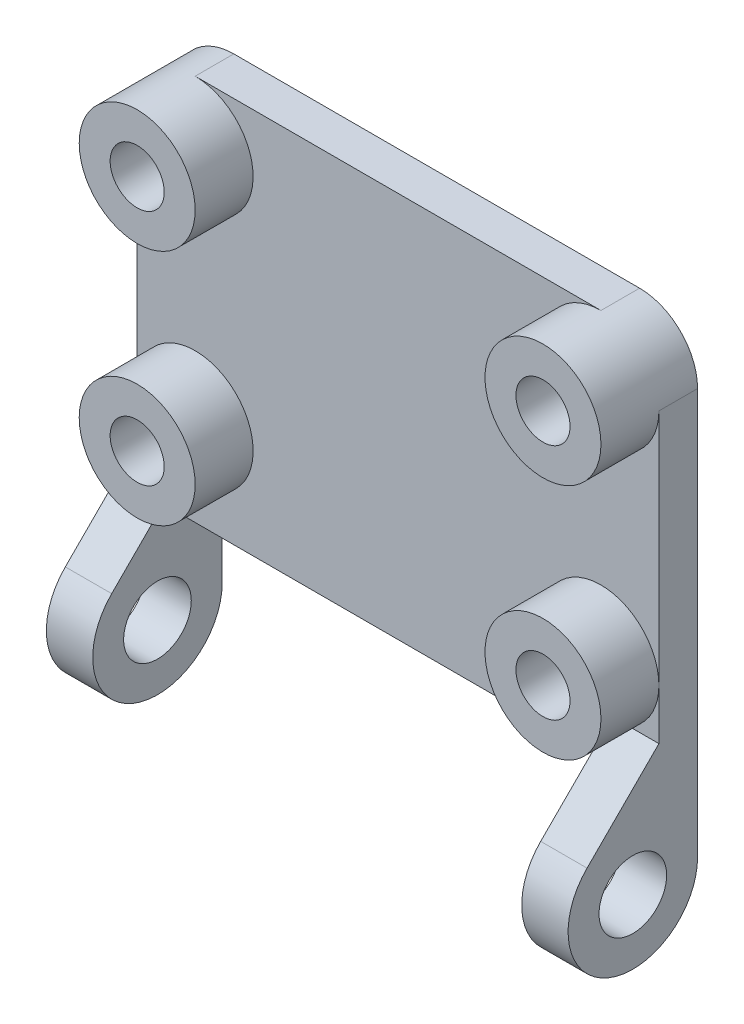
ISO-10303-21;
HEADER;
FILE_DESCRIPTION(('STEP AP214'),'2;1');
FILE_NAME('part.step','',(''),(''),'','','');
FILE_SCHEMA(('AUTOMOTIVE_DESIGN { 1 0 10303 214 1 1 1 1 }'));
ENDSEC;
DATA;
#1=APPLICATION_CONTEXT('core data for automotive mechanical design processes');
#2=APPLICATION_PROTOCOL_DEFINITION('international standard','automotive_design',2000,#1);
#3=PRODUCT_CONTEXT('',#1,'mechanical');
#4=PRODUCT('Part','Part','',(#3));
#5=PRODUCT_RELATED_PRODUCT_CATEGORY('part','',(#4));
#6=PRODUCT_DEFINITION_FORMATION('','',#4);
#7=PRODUCT_DEFINITION_CONTEXT('part definition',#1,'design');
#8=PRODUCT_DEFINITION('design','',#6,#7);
#9=PRODUCT_DEFINITION_SHAPE('','',#8);
#10=(LENGTH_UNIT() NAMED_UNIT(*) SI_UNIT(.MILLI.,.METRE.));
#11=(NAMED_UNIT(*) PLANE_ANGLE_UNIT() SI_UNIT($,.RADIAN.));
#12=(NAMED_UNIT(*) SI_UNIT($,.STERADIAN.) SOLID_ANGLE_UNIT());
#13=UNCERTAINTY_MEASURE_WITH_UNIT(LENGTH_MEASURE(1.E-05),#10,'distance_accuracy_value','');
#14=(GEOMETRIC_REPRESENTATION_CONTEXT(3) GLOBAL_UNCERTAINTY_ASSIGNED_CONTEXT((#13)) GLOBAL_UNIT_ASSIGNED_CONTEXT((#10,
#11,#12)) REPRESENTATION_CONTEXT('',''));
#15=CARTESIAN_POINT('',(0.,0.,0.));
#16=DIRECTION('',(0.,0.,1.));
#17=DIRECTION('',(1.,0.,0.));
#18=AXIS2_PLACEMENT_3D('',#15,#16,#17);
#19=CARTESIAN_POINT('',(0.,0.,2.));
#20=DIRECTION('',(0.,0.,-1.));
#21=DIRECTION('',(-1.,0.,0.));
#22=AXIS2_PLACEMENT_3D('',#19,#20,#21);
#23=PLANE('',#22);
#24=CARTESIAN_POINT('',(10.5,7.,2.));
#25=DIRECTION('',(0.,0.,1.));
#26=DIRECTION('',(1.,0.,0.));
#27=AXIS2_PLACEMENT_3D('',#24,#25,#26);
#28=CIRCLE('',#27,3.);
#29=CARTESIAN_POINT('',(10.5,10.,2.));
#30=VERTEX_POINT('',#29);
#31=CARTESIAN_POINT('',(13.5,7.,2.));
#32=VERTEX_POINT('',#31);
#33=EDGE_CURVE('E148',#30,#32,#28,.T.);
#34=ORIENTED_EDGE('',*,*,#33,.F.);
#35=DIRECTION('',(-1.,0.,0.));
#36=VECTOR('',#35,1.);
#37=CARTESIAN_POINT('',(-13.5,10.,2.));
#38=LINE('',#37,#36);
#39=CARTESIAN_POINT('',(-10.5,10.,2.));
#40=VERTEX_POINT('',#39);
#41=EDGE_CURVE('E157',#30,#40,#38,.T.);
#42=ORIENTED_EDGE('',*,*,#41,.T.);
#43=CARTESIAN_POINT('',(-10.5,7.,2.));
#44=DIRECTION('',(0.,0.,1.));
#45=DIRECTION('',(1.,0.,0.));
#46=AXIS2_PLACEMENT_3D('',#43,#44,#45);
#47=CIRCLE('',#46,3.);
#48=CARTESIAN_POINT('',(-13.5,7.,2.));
#49=VERTEX_POINT('',#48);
#50=EDGE_CURVE('E201',#49,#40,#47,.T.);
#51=ORIENTED_EDGE('',*,*,#50,.F.);
#52=DIRECTION('',(0.,-1.,0.));
#53=VECTOR('',#52,1.);
#54=CARTESIAN_POINT('',(-13.5,-10.,2.));
#55=LINE('',#54,#53);
#56=CARTESIAN_POINT('',(-13.5,-5.3,2.));
#57=VERTEX_POINT('',#56);
#58=EDGE_CURVE('E285',#49,#57,#55,.T.);
#59=ORIENTED_EDGE('',*,*,#58,.T.);
#60=CARTESIAN_POINT('',(-10.5,-5.3,2.));
#61=DIRECTION('',(0.,0.,1.));
#62=DIRECTION('',(1.,0.,0.));
#63=AXIS2_PLACEMENT_3D('',#60,#61,#62);
#64=CIRCLE('',#63,3.);
#65=CARTESIAN_POINT('',(-11.1,-8.23938769133981,2.));
#66=VERTEX_POINT('',#65);
#67=EDGE_CURVE('E188',#66,#57,#64,.T.);
#68=ORIENTED_EDGE('',*,*,#67,.F.);
#69=DIRECTION('',(0.,1.,0.));
#70=VECTOR('',#69,1.);
#71=CARTESIAN_POINT('',(-11.1,-7.91238456605009,2.));
#72=LINE('',#71,#70);
#73=CARTESIAN_POINT('',(-11.1,-10.,2.));
#74=VERTEX_POINT('',#73);
#75=EDGE_CURVE('E224',#74,#66,#72,.T.);
#76=ORIENTED_EDGE('',*,*,#75,.F.);
#77=DIRECTION('',(1.,0.,0.));
#78=VECTOR('',#77,1.);
#79=CARTESIAN_POINT('',(-13.5,-10.,2.));
#80=LINE('',#79,#78);
#81=CARTESIAN_POINT('',(11.1,-10.,2.));
#82=VERTEX_POINT('',#81);
#83=EDGE_CURVE('E288',#74,#82,#80,.T.);
#84=ORIENTED_EDGE('',*,*,#83,.T.);
#85=DIRECTION('',(0.,1.,0.));
#86=VECTOR('',#85,1.);
#87=CARTESIAN_POINT('',(11.1,-7.91238456605009,2.));
#88=LINE('',#87,#86);
#89=CARTESIAN_POINT('',(11.1,-8.23938769133981,2.));
#90=VERTEX_POINT('',#89);
#91=EDGE_CURVE('E249',#82,#90,#88,.T.);
#92=ORIENTED_EDGE('',*,*,#91,.T.);
#93=CARTESIAN_POINT('',(10.5,-5.3,2.));
#94=DIRECTION('',(0.,0.,1.));
#95=DIRECTION('',(1.,0.,0.));
#96=AXIS2_PLACEMENT_3D('',#93,#94,#95);
#97=CIRCLE('',#96,3.);
#98=CARTESIAN_POINT('',(13.5,-5.3,2.));
#99=VERTEX_POINT('',#98);
#100=EDGE_CURVE('E48',#99,#90,#97,.T.);
#101=ORIENTED_EDGE('',*,*,#100,.F.);
#102=DIRECTION('',(0.,1.,0.));
#103=VECTOR('',#102,1.);
#104=CARTESIAN_POINT('',(13.5,-10.,2.));
#105=LINE('',#104,#103);
#106=EDGE_CURVE('E165',#99,#32,#105,.T.);
#107=ORIENTED_EDGE('',*,*,#106,.T.);
#108=EDGE_LOOP('',(#34,#42,#51,#59,#68,#76,#84,#92,#101,#107));
#109=FACE_BOUND('',#108,.T.);
#110=ADVANCED_FACE('F33',(#109),#23,.F.);
#111=CARTESIAN_POINT('',(11.9749396187856,-7.91238456605009,2.));
#112=VERTEX_POINT('',#111);
#113=EDGE_CURVE('E56',#112,#99,#97,.T.);
#114=ORIENTED_EDGE('',*,*,#113,.F.);
#115=DIRECTION('',(1.,0.,0.));
#116=VECTOR('',#115,1.);
#117=CARTESIAN_POINT('',(11.1,-7.91238456605009,2.));
#118=LINE('',#117,#116);
#119=CARTESIAN_POINT('',(13.5,-7.91238456605009,2.));
#120=VERTEX_POINT('',#119);
#121=EDGE_CURVE('E260',#112,#120,#118,.T.);
#122=ORIENTED_EDGE('',*,*,#121,.T.);
#123=EDGE_CURVE('E163',#120,#99,#105,.T.);
#124=ORIENTED_EDGE('',*,*,#123,.T.);
#125=EDGE_LOOP('',(#114,#122,#124));
#126=FACE_BOUND('',#125,.T.);
#127=ADVANCED_FACE('F386',(#126),#23,.F.);
#128=CARTESIAN_POINT('',(11.1,-14.,3.35));
#129=DIRECTION('',(1.,0.,0.));
#130=DIRECTION('',(0.,0.,-1.));
#131=AXIS2_PLACEMENT_3D('',#128,#129,#130);
#132=PLANE('',#131);
#133=CARTESIAN_POINT('',(11.1,-14.,3.35));
#134=DIRECTION('',(1.,0.,0.));
#135=DIRECTION('',(0.,0.,-1.));
#136=AXIS2_PLACEMENT_3D('',#133,#134,#135);
#137=CIRCLE('',#136,1.75);
#138=CARTESIAN_POINT('',(11.1,-14.,1.6));
#139=VERTEX_POINT('',#138);
#140=EDGE_CURVE('E240',#139,#139,#137,.T.);
#141=ORIENTED_EDGE('',*,*,#140,.T.);
#142=EDGE_LOOP('',(#141));
#143=FACE_BOUND('',#142,.T.);
#144=DIRECTION('',(0.,0.,-1.));
#145=VECTOR('',#144,1.);
#146=CARTESIAN_POINT('',(11.1,-8.23938769133981,5.));
#147=LINE('',#146,#145);
#148=CARTESIAN_POINT('',(11.1,-8.23938769133981,2.32700312528972));
#149=VERTEX_POINT('',#148);
#150=EDGE_CURVE('E11',#90,#149,#147,.F.);
#151=ORIENTED_EDGE('',*,*,#150,.F.);
#152=ORIENTED_EDGE('',*,*,#91,.F.);
#153=DIRECTION('',(0.,0.,1.));
#154=VECTOR('',#153,1.);
#155=CARTESIAN_POINT('',(11.1,-10.,0.));
#156=LINE('',#155,#154);
#157=CARTESIAN_POINT('',(11.1,-10.,0.));
#158=VERTEX_POINT('',#157);
#159=EDGE_CURVE('E246',#158,#82,#156,.T.);
#160=ORIENTED_EDGE('',*,*,#159,.F.);
#161=DIRECTION('',(0.,1.,0.));
#162=VECTOR('',#161,1.);
#163=CARTESIAN_POINT('',(11.1,-10.,0.));
#164=LINE('',#163,#162);
#165=CARTESIAN_POINT('',(11.1,-14.,0.));
#166=VERTEX_POINT('',#165);
#167=EDGE_CURVE('E257',#166,#158,#164,.T.);
#168=ORIENTED_EDGE('',*,*,#167,.F.);
#169=CARTESIAN_POINT('',(11.1,-14.,3.35));
#170=DIRECTION('',(1.,0.,0.));
#171=DIRECTION('',(0.,0.,-1.));
#172=AXIS2_PLACEMENT_3D('',#169,#170,#171);
#173=CIRCLE('',#172,3.35);
#174=CARTESIAN_POINT('',(11.1,-11.6311922830251,5.71880771697495));
#175=VERTEX_POINT('',#174);
#176=EDGE_CURVE('E254',#175,#166,#173,.T.);
#177=ORIENTED_EDGE('',*,*,#176,.F.);
#178=DIRECTION('',(0.,-0.707106781186552,0.707106781186543));
#179=VECTOR('',#178,1.);
#180=CARTESIAN_POINT('',(11.1,-11.6311922830251,5.71880771697495));
#181=LINE('',#180,#179);
#182=EDGE_CURVE('E252',#149,#175,#181,.T.);
#183=ORIENTED_EDGE('',*,*,#182,.F.);
#184=EDGE_LOOP('',(#151,#152,#160,#168,#177,#183));
#185=FACE_BOUND('',#184,.T.);
#186=ADVANCED_FACE('F344',(#143,#185),#132,.F.);
#187=CARTESIAN_POINT('',(-11.9749396187856,-7.91238456605009,2.));
#188=VERTEX_POINT('',#187);
#189=EDGE_CURVE('E193',#57,#188,#64,.T.);
#190=ORIENTED_EDGE('',*,*,#189,.F.);
#191=CARTESIAN_POINT('',(-13.5,-7.91238456605009,2.));
#192=VERTEX_POINT('',#191);
#193=EDGE_CURVE('E162',#57,#192,#55,.T.);
#194=ORIENTED_EDGE('',*,*,#193,.T.);
#195=DIRECTION('',(-1.,0.,0.));
#196=VECTOR('',#195,1.);
#197=CARTESIAN_POINT('',(-11.1,-7.91238456605009,2.));
#198=LINE('',#197,#196);
#199=EDGE_CURVE('E231',#188,#192,#198,.T.);
#200=ORIENTED_EDGE('',*,*,#199,.F.);
#201=EDGE_LOOP('',(#190,#194,#200));
#202=FACE_BOUND('',#201,.T.);
#203=ADVANCED_FACE('F316',(#202),#23,.F.);
#204=CARTESIAN_POINT('',(-11.1,-14.,3.35));
#205=DIRECTION('',(-1.,0.,0.));
#206=DIRECTION('',(0.,0.,-1.));
#207=AXIS2_PLACEMENT_3D('',#204,#205,#206);
#208=PLANE('',#207);
#209=CARTESIAN_POINT('',(-11.1,-14.,3.35));
#210=DIRECTION('',(1.,0.,0.));
#211=DIRECTION('',(0.,0.,-1.));
#212=AXIS2_PLACEMENT_3D('',#209,#210,#211);
#213=CIRCLE('',#212,1.75);
#214=CARTESIAN_POINT('',(-11.1,-14.,1.6));
#215=VERTEX_POINT('',#214);
#216=EDGE_CURVE('E207',#215,#215,#213,.T.);
#217=ORIENTED_EDGE('',*,*,#216,.F.);
#218=EDGE_LOOP('',(#217));
#219=FACE_BOUND('',#218,.T.);
#220=DIRECTION('',(0.,0.,-1.));
#221=VECTOR('',#220,1.);
#222=CARTESIAN_POINT('',(-11.1,-8.23938769133981,5.));
#223=LINE('',#222,#221);
#224=CARTESIAN_POINT('',(-11.1,-8.23938769133981,2.32700312528972));
#225=VERTEX_POINT('',#224);
#226=EDGE_CURVE('E192',#225,#66,#223,.T.);
#227=ORIENTED_EDGE('',*,*,#226,.F.);
#228=DIRECTION('',(0.,-0.707106781186552,0.707106781186543));
#229=VECTOR('',#228,1.);
#230=CARTESIAN_POINT('',(-11.1,-11.6311922830251,5.71880771697495));
#231=LINE('',#230,#229);
#232=CARTESIAN_POINT('',(-11.1,-11.6311922830251,5.71880771697495));
#233=VERTEX_POINT('',#232);
#234=EDGE_CURVE('E222',#225,#233,#231,.T.);
#235=ORIENTED_EDGE('',*,*,#234,.T.);
#236=CARTESIAN_POINT('',(-11.1,-14.,3.35));
#237=DIRECTION('',(1.,0.,0.));
#238=DIRECTION('',(0.,0.,-1.));
#239=AXIS2_PLACEMENT_3D('',#236,#237,#238);
#240=CIRCLE('',#239,3.35);
#241=CARTESIAN_POINT('',(-11.1,-14.,0.));
#242=VERTEX_POINT('',#241);
#243=EDGE_CURVE('E220',#233,#242,#240,.T.);
#244=ORIENTED_EDGE('',*,*,#243,.T.);
#245=DIRECTION('',(0.,1.,0.));
#246=VECTOR('',#245,1.);
#247=CARTESIAN_POINT('',(-11.1,-10.,0.));
#248=LINE('',#247,#246);
#249=CARTESIAN_POINT('',(-11.1,-10.,0.));
#250=VERTEX_POINT('',#249);
#251=EDGE_CURVE('E216',#242,#250,#248,.T.);
#252=ORIENTED_EDGE('',*,*,#251,.T.);
#253=DIRECTION('',(0.,0.,1.));
#254=VECTOR('',#253,1.);
#255=CARTESIAN_POINT('',(-11.1,-10.,0.));
#256=LINE('',#255,#254);
#257=EDGE_CURVE('E213',#250,#74,#256,.T.);
#258=ORIENTED_EDGE('',*,*,#257,.T.);
#259=ORIENTED_EDGE('',*,*,#75,.T.);
#260=EDGE_LOOP('',(#227,#235,#244,#252,#258,#259));
#261=FACE_BOUND('',#260,.T.);
#262=ADVANCED_FACE('F336',(#219,#261),#208,.F.);
#263=CARTESIAN_POINT('',(-13.5,-10.,2.));
#264=DIRECTION('',(0.,1.,0.));
#265=DIRECTION('',(0.,0.,1.));
#266=AXIS2_PLACEMENT_3D('',#263,#264,#265);
#267=PLANE('',#266);
#268=ORIENTED_EDGE('',*,*,#257,.F.);
#269=DIRECTION('',(1.,0.,0.));
#270=VECTOR('',#269,1.);
#271=CARTESIAN_POINT('',(-13.5,-10.,0.));
#272=LINE('',#271,#270);
#273=EDGE_CURVE('E296',#250,#158,#272,.T.);
#274=ORIENTED_EDGE('',*,*,#273,.T.);
#275=ORIENTED_EDGE('',*,*,#159,.T.);
#276=ORIENTED_EDGE('',*,*,#83,.F.);
#277=EDGE_LOOP('',(#268,#274,#275,#276));
#278=FACE_BOUND('',#277,.T.);
#279=ADVANCED_FACE('F340',(#278),#267,.F.);
#280=CARTESIAN_POINT('',(0.,0.,0.));
#281=DIRECTION('',(0.,0.,-1.));
#282=DIRECTION('',(-1.,0.,0.));
#283=AXIS2_PLACEMENT_3D('',#280,#281,#282);
#284=PLANE('',#283);
#285=CARTESIAN_POINT('',(10.5,-5.3,0.));
#286=DIRECTION('',(0.,0.,1.));
#287=DIRECTION('',(1.,0.,0.));
#288=AXIS2_PLACEMENT_3D('',#285,#286,#287);
#289=CIRCLE('',#288,1.4);
#290=CARTESIAN_POINT('',(11.9,-5.3,0.));
#291=VERTEX_POINT('',#290);
#292=EDGE_CURVE('E274',#291,#291,#289,.T.);
#293=ORIENTED_EDGE('',*,*,#292,.T.);
#294=EDGE_LOOP('',(#293));
#295=FACE_BOUND('',#294,.T.);
#296=CARTESIAN_POINT('',(-10.5,7.,0.));
#297=DIRECTION('',(0.,0.,1.));
#298=DIRECTION('',(1.,0.,0.));
#299=AXIS2_PLACEMENT_3D('',#296,#297,#298);
#300=CIRCLE('',#299,1.4);
#301=CARTESIAN_POINT('',(-9.1,7.,0.));
#302=VERTEX_POINT('',#301);
#303=EDGE_CURVE('E280',#302,#302,#300,.T.);
#304=ORIENTED_EDGE('',*,*,#303,.T.);
#305=EDGE_LOOP('',(#304));
#306=FACE_BOUND('',#305,.T.);
#307=DIRECTION('',(-1.,0.,0.));
#308=VECTOR('',#307,1.);
#309=CARTESIAN_POINT('',(-13.5,10.,0.));
#310=LINE('',#309,#308);
#311=CARTESIAN_POINT('',(10.5,10.,0.));
#312=VERTEX_POINT('',#311);
#313=CARTESIAN_POINT('',(-10.5,10.,0.));
#314=VERTEX_POINT('',#313);
#315=EDGE_CURVE('E292',#312,#314,#310,.T.);
#316=ORIENTED_EDGE('',*,*,#315,.F.);
#317=CARTESIAN_POINT('',(10.5,7.,0.));
#318=DIRECTION('',(0.,0.,-1.));
#319=DIRECTION('',(-1.,0.,0.));
#320=AXIS2_PLACEMENT_3D('',#317,#318,#319);
#321=CIRCLE('',#320,3.);
#322=CARTESIAN_POINT('',(13.5,7.,0.));
#323=VERTEX_POINT('',#322);
#324=EDGE_CURVE('E149',#312,#323,#321,.T.);
#325=ORIENTED_EDGE('',*,*,#324,.T.);
#326=DIRECTION('',(0.,1.,0.));
#327=VECTOR('',#326,1.);
#328=CARTESIAN_POINT('',(13.5,-10.,0.));
#329=LINE('',#328,#327);
#330=CARTESIAN_POINT('',(13.5,-14.,0.));
#331=VERTEX_POINT('',#330);
#332=EDGE_CURVE('E283',#331,#323,#329,.T.);
#333=ORIENTED_EDGE('',*,*,#332,.F.);
#334=DIRECTION('',(1.,0.,0.));
#335=VECTOR('',#334,1.);
#336=CARTESIAN_POINT('',(11.1,-14.,0.));
#337=LINE('',#336,#335);
#338=EDGE_CURVE('E265',#166,#331,#337,.T.);
#339=ORIENTED_EDGE('',*,*,#338,.F.);
#340=ORIENTED_EDGE('',*,*,#167,.T.);
#341=ORIENTED_EDGE('',*,*,#273,.F.);
#342=ORIENTED_EDGE('',*,*,#251,.F.);
#343=DIRECTION('',(-1.,0.,0.));
#344=VECTOR('',#343,1.);
#345=CARTESIAN_POINT('',(-11.1,-14.,0.));
#346=LINE('',#345,#344);
#347=CARTESIAN_POINT('',(-13.5,-14.,0.));
#348=VERTEX_POINT('',#347);
#349=EDGE_CURVE('E227',#242,#348,#346,.T.);
#350=ORIENTED_EDGE('',*,*,#349,.T.);
#351=DIRECTION('',(0.,-1.,0.));
#352=VECTOR('',#351,1.);
#353=CARTESIAN_POINT('',(-13.5,-10.,0.));
#354=LINE('',#353,#352);
#355=CARTESIAN_POINT('',(-13.5,7.,0.));
#356=VERTEX_POINT('',#355);
#357=EDGE_CURVE('E294',#356,#348,#354,.T.);
#358=ORIENTED_EDGE('',*,*,#357,.F.);
#359=CARTESIAN_POINT('',(-10.5,7.,0.));
#360=DIRECTION('',(0.,0.,-1.));
#361=DIRECTION('',(-1.,0.,0.));
#362=AXIS2_PLACEMENT_3D('',#359,#360,#361);
#363=CIRCLE('',#362,3.);
#364=EDGE_CURVE('E153',#356,#314,#363,.T.);
#365=ORIENTED_EDGE('',*,*,#364,.T.);
#366=EDGE_LOOP('',(#316,#325,#333,#339,#340,#341,#342,#350,#358,#365));
#367=FACE_BOUND('',#366,.T.);
#368=CARTESIAN_POINT('',(-10.5,-5.3,0.));
#369=DIRECTION('',(0.,0.,1.));
#370=DIRECTION('',(1.,0.,0.));
#371=AXIS2_PLACEMENT_3D('',#368,#369,#370);
#372=CIRCLE('',#371,1.4);
#373=CARTESIAN_POINT('',(-9.1,-5.3,0.));
#374=VERTEX_POINT('',#373);
#375=EDGE_CURVE('E277',#374,#374,#372,.T.);
#376=ORIENTED_EDGE('',*,*,#375,.T.);
#377=EDGE_LOOP('',(#376));
#378=FACE_BOUND('',#377,.T.);
#379=CARTESIAN_POINT('',(10.5,7.,0.));
#380=DIRECTION('',(0.,0.,1.));
#381=DIRECTION('',(1.,0.,0.));
#382=AXIS2_PLACEMENT_3D('',#379,#380,#381);
#383=CIRCLE('',#382,1.4);
#384=CARTESIAN_POINT('',(11.9,7.,0.));
#385=VERTEX_POINT('',#384);
#386=EDGE_CURVE('E268',#385,#385,#383,.T.);
#387=ORIENTED_EDGE('',*,*,#386,.T.);
#388=EDGE_LOOP('',(#387));
#389=FACE_BOUND('',#388,.T.);
#390=ADVANCED_FACE('F327',(#295,#306,#367,#378,#389),#284,.T.);
#391=CARTESIAN_POINT('',(13.5,-10.,2.));
#392=DIRECTION('',(-1.,0.,0.));
#393=DIRECTION('',(0.,0.,1.));
#394=AXIS2_PLACEMENT_3D('',#391,#392,#393);
#395=PLANE('',#394);
#396=ORIENTED_EDGE('',*,*,#123,.F.);
#397=DIRECTION('',(0.,-0.707106781186552,0.707106781186543));
#398=VECTOR('',#397,1.);
#399=CARTESIAN_POINT('',(13.5,-11.6311922830251,5.71880771697495));
#400=LINE('',#399,#398);
#401=CARTESIAN_POINT('',(13.5,-11.6311922830251,5.71880771697495));
#402=VERTEX_POINT('',#401);
#403=EDGE_CURVE('E243',#120,#402,#400,.T.);
#404=ORIENTED_EDGE('',*,*,#403,.T.);
#405=CARTESIAN_POINT('',(13.5,-14.,3.35));
#406=DIRECTION('',(1.,0.,0.));
#407=DIRECTION('',(0.,0.,-1.));
#408=AXIS2_PLACEMENT_3D('',#405,#406,#407);
#409=CIRCLE('',#408,3.35);
#410=EDGE_CURVE('E250',#402,#331,#409,.T.);
#411=ORIENTED_EDGE('',*,*,#410,.T.);
#412=ORIENTED_EDGE('',*,*,#332,.T.);
#413=DIRECTION('',(0.,0.,-1.));
#414=VECTOR('',#413,1.);
#415=CARTESIAN_POINT('',(13.5,7.,2.));
#416=LINE('',#415,#414);
#417=EDGE_CURVE('E301',#323,#32,#416,.F.);
#418=ORIENTED_EDGE('',*,*,#417,.T.);
#419=ORIENTED_EDGE('',*,*,#106,.F.);
#420=EDGE_LOOP('',(#396,#404,#411,#412,#418,#419));
#421=FACE_BOUND('',#420,.T.);
#422=CARTESIAN_POINT('',(13.5,-14.,3.35));
#423=DIRECTION('',(1.,0.,0.));
#424=DIRECTION('',(0.,0.,-1.));
#425=AXIS2_PLACEMENT_3D('',#422,#423,#424);
#426=CIRCLE('',#425,1.75);
#427=CARTESIAN_POINT('',(13.5,-14.,1.6));
#428=VERTEX_POINT('',#427);
#429=EDGE_CURVE('E234',#428,#428,#426,.T.);
#430=ORIENTED_EDGE('',*,*,#429,.F.);
#431=EDGE_LOOP('',(#430));
#432=FACE_BOUND('',#431,.T.);
#433=ADVANCED_FACE('F423',(#421,#432),#395,.F.);
#434=CARTESIAN_POINT('',(-13.5,10.,2.));
#435=DIRECTION('',(0.,-1.,0.));
#436=DIRECTION('',(0.,0.,-1.));
#437=AXIS2_PLACEMENT_3D('',#434,#435,#436);
#438=PLANE('',#437);
#439=ORIENTED_EDGE('',*,*,#41,.F.);
#440=DIRECTION('',(0.,0.,-1.));
#441=VECTOR('',#440,1.);
#442=CARTESIAN_POINT('',(10.5,10.,2.));
#443=LINE('',#442,#441);
#444=EDGE_CURVE('E142',#30,#312,#443,.T.);
#445=ORIENTED_EDGE('',*,*,#444,.T.);
#446=ORIENTED_EDGE('',*,*,#315,.T.);
#447=DIRECTION('',(0.,0.,-1.));
#448=VECTOR('',#447,1.);
#449=CARTESIAN_POINT('',(-10.5,10.,2.));
#450=LINE('',#449,#448);
#451=EDGE_CURVE('E154',#314,#40,#450,.F.);
#452=ORIENTED_EDGE('',*,*,#451,.T.);
#453=EDGE_LOOP('',(#439,#445,#446,#452));
#454=FACE_BOUND('',#453,.T.);
#455=ADVANCED_FACE('F158',(#454),#438,.F.);
#456=CARTESIAN_POINT('',(-13.5,-10.,2.));
#457=DIRECTION('',(1.,0.,0.));
#458=DIRECTION('',(0.,0.,-1.));
#459=AXIS2_PLACEMENT_3D('',#456,#457,#458);
#460=PLANE('',#459);
#461=ORIENTED_EDGE('',*,*,#357,.T.);
#462=CARTESIAN_POINT('',(-13.5,-14.,3.35));
#463=DIRECTION('',(1.,0.,0.));
#464=DIRECTION('',(0.,0.,-1.));
#465=AXIS2_PLACEMENT_3D('',#462,#463,#464);
#466=CIRCLE('',#465,3.35);
#467=CARTESIAN_POINT('',(-13.5,-11.6311922830251,5.71880771697495));
#468=VERTEX_POINT('',#467);
#469=EDGE_CURVE('E210',#468,#348,#466,.T.);
#470=ORIENTED_EDGE('',*,*,#469,.F.);
#471=DIRECTION('',(0.,-0.707106781186552,0.707106781186543));
#472=VECTOR('',#471,1.);
#473=CARTESIAN_POINT('',(-13.5,-11.6311922830251,5.71880771697495));
#474=LINE('',#473,#472);
#475=EDGE_CURVE('E217',#192,#468,#474,.T.);
#476=ORIENTED_EDGE('',*,*,#475,.F.);
#477=ORIENTED_EDGE('',*,*,#193,.F.);
#478=ORIENTED_EDGE('',*,*,#58,.F.);
#479=DIRECTION('',(0.,0.,-1.));
#480=VECTOR('',#479,1.);
#481=CARTESIAN_POINT('',(-13.5,7.,2.));
#482=LINE('',#481,#480);
#483=EDGE_CURVE('E303',#49,#356,#482,.T.);
#484=ORIENTED_EDGE('',*,*,#483,.T.);
#485=EDGE_LOOP('',(#461,#470,#476,#477,#478,#484));
#486=FACE_BOUND('',#485,.T.);
#487=CARTESIAN_POINT('',(-13.5,-14.,3.35));
#488=DIRECTION('',(1.,0.,0.));
#489=DIRECTION('',(0.,0.,-1.));
#490=AXIS2_PLACEMENT_3D('',#487,#488,#489);
#491=CIRCLE('',#490,1.75);
#492=CARTESIAN_POINT('',(-13.5,-14.,1.6));
#493=VERTEX_POINT('',#492);
#494=EDGE_CURVE('E205',#493,#493,#491,.T.);
#495=ORIENTED_EDGE('',*,*,#494,.T.);
#496=EDGE_LOOP('',(#495));
#497=FACE_BOUND('',#496,.T.);
#498=ADVANCED_FACE('F320',(#486,#497),#460,.F.);
#499=CARTESIAN_POINT('',(-10.5,7.,2.));
#500=DIRECTION('',(0.,0.,-1.));
#501=DIRECTION('',(-1.,0.,0.));
#502=AXIS2_PLACEMENT_3D('',#499,#500,#501);
#503=CYLINDRICAL_SURFACE('',#502,1.4);
#504=ORIENTED_EDGE('',*,*,#303,.F.);
#505=EDGE_LOOP('',(#504));
#506=FACE_BOUND('',#505,.T.);
#507=CARTESIAN_POINT('',(-10.5,7.,5.));
#508=DIRECTION('',(0.,0.,1.));
#509=DIRECTION('',(1.,0.,0.));
#510=AXIS2_PLACEMENT_3D('',#507,#508,#509);
#511=CIRCLE('',#510,1.4);
#512=CARTESIAN_POINT('',(-9.1,7.,5.));
#513=VERTEX_POINT('',#512);
#514=EDGE_CURVE('E198',#513,#513,#511,.T.);
#515=ORIENTED_EDGE('',*,*,#514,.T.);
#516=EDGE_LOOP('',(#515));
#517=FACE_BOUND('',#516,.T.);
#518=ADVANCED_FACE('F381',(#506,#517),#503,.F.);
#519=CARTESIAN_POINT('',(-10.5,-5.3,2.));
#520=DIRECTION('',(0.,0.,-1.));
#521=DIRECTION('',(-1.,0.,0.));
#522=AXIS2_PLACEMENT_3D('',#519,#520,#521);
#523=CYLINDRICAL_SURFACE('',#522,1.4);
#524=ORIENTED_EDGE('',*,*,#375,.F.);
#525=EDGE_LOOP('',(#524));
#526=FACE_BOUND('',#525,.T.);
#527=CARTESIAN_POINT('',(-10.5,-5.3,5.));
#528=DIRECTION('',(0.,0.,1.));
#529=DIRECTION('',(1.,0.,0.));
#530=AXIS2_PLACEMENT_3D('',#527,#528,#529);
#531=CIRCLE('',#530,1.4);
#532=CARTESIAN_POINT('',(-9.1,-5.3,5.));
#533=VERTEX_POINT('',#532);
#534=EDGE_CURVE('E185',#533,#533,#531,.T.);
#535=ORIENTED_EDGE('',*,*,#534,.T.);
#536=EDGE_LOOP('',(#535));
#537=FACE_BOUND('',#536,.T.);
#538=ADVANCED_FACE('F372',(#526,#537),#523,.F.);
#539=CARTESIAN_POINT('',(10.5,-5.3,2.));
#540=DIRECTION('',(0.,0.,-1.));
#541=DIRECTION('',(-1.,0.,0.));
#542=AXIS2_PLACEMENT_3D('',#539,#540,#541);
#543=CYLINDRICAL_SURFACE('',#542,1.4);
#544=ORIENTED_EDGE('',*,*,#292,.F.);
#545=EDGE_LOOP('',(#544));
#546=FACE_BOUND('',#545,.T.);
#547=CARTESIAN_POINT('',(10.5,-5.3,5.));
#548=DIRECTION('',(0.,0.,1.));
#549=DIRECTION('',(1.,0.,0.));
#550=AXIS2_PLACEMENT_3D('',#547,#548,#549);
#551=CIRCLE('',#550,1.4);
#552=CARTESIAN_POINT('',(11.9,-5.3,5.));
#553=VERTEX_POINT('',#552);
#554=EDGE_CURVE('E171',#553,#553,#551,.T.);
#555=ORIENTED_EDGE('',*,*,#554,.T.);
#556=EDGE_LOOP('',(#555));
#557=FACE_BOUND('',#556,.T.);
#558=ADVANCED_FACE('F369',(#546,#557),#543,.F.);
#559=CARTESIAN_POINT('',(10.5,7.,2.));
#560=DIRECTION('',(0.,0.,-1.));
#561=DIRECTION('',(-1.,0.,0.));
#562=AXIS2_PLACEMENT_3D('',#559,#560,#561);
#563=CYLINDRICAL_SURFACE('',#562,1.4);
#564=ORIENTED_EDGE('',*,*,#386,.F.);
#565=EDGE_LOOP('',(#564));
#566=FACE_BOUND('',#565,.T.);
#567=CARTESIAN_POINT('',(10.5,7.,5.));
#568=DIRECTION('',(0.,0.,1.));
#569=DIRECTION('',(1.,0.,0.));
#570=AXIS2_PLACEMENT_3D('',#567,#568,#569);
#571=CIRCLE('',#570,1.4);
#572=CARTESIAN_POINT('',(11.9,7.,5.));
#573=VERTEX_POINT('',#572);
#574=EDGE_CURVE('E168',#573,#573,#571,.T.);
#575=ORIENTED_EDGE('',*,*,#574,.T.);
#576=EDGE_LOOP('',(#575));
#577=FACE_BOUND('',#576,.T.);
#578=ADVANCED_FACE('F371',(#566,#577),#563,.F.);
#579=CARTESIAN_POINT('',(10.5,7.,2.));
#580=DIRECTION('',(0.,0.,-1.));
#581=DIRECTION('',(-1.,0.,0.));
#582=AXIS2_PLACEMENT_3D('',#579,#580,#581);
#583=CYLINDRICAL_SURFACE('',#582,3.);
#584=ORIENTED_EDGE('',*,*,#444,.F.);
#585=ORIENTED_EDGE('',*,*,#33,.T.);
#586=ORIENTED_EDGE('',*,*,#417,.F.);
#587=ORIENTED_EDGE('',*,*,#324,.F.);
#588=EDGE_LOOP('',(#584,#585,#586,#587));
#589=FACE_BOUND('',#588,.T.);
#590=CARTESIAN_POINT('',(10.5,7.,5.));
#591=DIRECTION('',(0.,0.,1.));
#592=DIRECTION('',(1.,0.,0.));
#593=AXIS2_PLACEMENT_3D('',#590,#591,#592);
#594=CIRCLE('',#593,3.);
#595=CARTESIAN_POINT('',(13.5,7.,5.));
#596=VERTEX_POINT('',#595);
#597=EDGE_CURVE('E167',#596,#596,#594,.T.);
#598=ORIENTED_EDGE('',*,*,#597,.F.);
#599=EDGE_LOOP('',(#598));
#600=FACE_BOUND('',#599,.T.);
#601=ADVANCED_FACE('F144',(#589,#600),#583,.T.);
#602=CARTESIAN_POINT('',(-10.5,7.,2.));
#603=DIRECTION('',(0.,0.,-1.));
#604=DIRECTION('',(-1.,0.,0.));
#605=AXIS2_PLACEMENT_3D('',#602,#603,#604);
#606=CYLINDRICAL_SURFACE('',#605,3.);
#607=ORIENTED_EDGE('',*,*,#483,.F.);
#608=ORIENTED_EDGE('',*,*,#50,.T.);
#609=ORIENTED_EDGE('',*,*,#451,.F.);
#610=ORIENTED_EDGE('',*,*,#364,.F.);
#611=EDGE_LOOP('',(#607,#608,#609,#610));
#612=FACE_BOUND('',#611,.T.);
#613=CARTESIAN_POINT('',(-10.5,7.,5.));
#614=DIRECTION('',(0.,0.,1.));
#615=DIRECTION('',(1.,0.,0.));
#616=AXIS2_PLACEMENT_3D('',#613,#614,#615);
#617=CIRCLE('',#616,3.);
#618=CARTESIAN_POINT('',(-7.5,7.,5.));
#619=VERTEX_POINT('',#618);
#620=EDGE_CURVE('E202',#619,#619,#617,.T.);
#621=ORIENTED_EDGE('',*,*,#620,.F.);
#622=EDGE_LOOP('',(#621));
#623=FACE_BOUND('',#622,.T.);
#624=ADVANCED_FACE('F35',(#612,#623),#606,.T.);
#625=CARTESIAN_POINT('',(11.1,-14.,3.35));
#626=DIRECTION('',(1.,0.,0.));
#627=DIRECTION('',(0.,0.,-1.));
#628=AXIS2_PLACEMENT_3D('',#625,#626,#627);
#629=CYLINDRICAL_SURFACE('',#628,3.35);
#630=ORIENTED_EDGE('',*,*,#410,.F.);
#631=DIRECTION('',(1.,0.,0.));
#632=VECTOR('',#631,1.);
#633=CARTESIAN_POINT('',(11.1,-11.6311922830251,5.71880771697495));
#634=LINE('',#633,#632);
#635=EDGE_CURVE('E269',#175,#402,#634,.T.);
#636=ORIENTED_EDGE('',*,*,#635,.F.);
#637=ORIENTED_EDGE('',*,*,#176,.T.);
#638=ORIENTED_EDGE('',*,*,#338,.T.);
#639=EDGE_LOOP('',(#630,#636,#637,#638));
#640=FACE_BOUND('',#639,.T.);
#641=ADVANCED_FACE('F349',(#640),#629,.T.);
#642=CARTESIAN_POINT('',(11.1,-11.6311922830251,5.71880771697495));
#643=DIRECTION('',(0.,0.707106781186543,0.707106781186552));
#644=DIRECTION('',(0.,-0.707106781186552,0.707106781186543));
#645=AXIS2_PLACEMENT_3D('',#642,#643,#644);
#646=PLANE('',#645);
#647=ORIENTED_EDGE('',*,*,#121,.F.);
#648=CARTESIAN_POINT('',(10.5,-5.3,-0.612384566050058));
#649=DIRECTION('',(0.,0.707106781186543,0.707106781186552));
#650=DIRECTION('',(0.,0.707106781186552,-0.707106781186543));
#651=AXIS2_PLACEMENT_3D('',#648,#649,#650);
#652=ELLIPSE('',#651,4.24264068711926,3.);
#653=EDGE_CURVE('E181',#112,#149,#652,.F.);
#654=ORIENTED_EDGE('',*,*,#653,.T.);
#655=ORIENTED_EDGE('',*,*,#182,.T.);
#656=ORIENTED_EDGE('',*,*,#635,.T.);
#657=ORIENTED_EDGE('',*,*,#403,.F.);
#658=EDGE_LOOP('',(#647,#654,#655,#656,#657));
#659=FACE_BOUND('',#658,.T.);
#660=ADVANCED_FACE('F352',(#659),#646,.T.);
#661=CARTESIAN_POINT('',(11.1,-14.,3.35));
#662=DIRECTION('',(1.,0.,0.));
#663=DIRECTION('',(0.,0.,-1.));
#664=AXIS2_PLACEMENT_3D('',#661,#662,#663);
#665=CYLINDRICAL_SURFACE('',#664,1.75);
#666=ORIENTED_EDGE('',*,*,#140,.F.);
#667=EDGE_LOOP('',(#666));
#668=FACE_BOUND('',#667,.T.);
#669=ORIENTED_EDGE('',*,*,#429,.T.);
#670=EDGE_LOOP('',(#669));
#671=FACE_BOUND('',#670,.T.);
#672=ADVANCED_FACE('F406',(#668,#671),#665,.F.);
#673=CARTESIAN_POINT('',(-11.1,-11.6311922830251,5.71880771697495));
#674=DIRECTION('',(0.,-0.707106781186543,-0.707106781186552));
#675=DIRECTION('',(0.,0.707106781186552,-0.707106781186543));
#676=AXIS2_PLACEMENT_3D('',#673,#674,#675);
#677=PLANE('',#676);
#678=CARTESIAN_POINT('',(-10.5,-5.3,-0.612384566050058));
#679=DIRECTION('',(0.,-0.707106781186543,-0.707106781186552));
#680=DIRECTION('',(0.,0.707106781186552,-0.707106781186543));
#681=AXIS2_PLACEMENT_3D('',#678,#679,#680);
#682=ELLIPSE('',#681,4.24264068711926,3.);
#683=EDGE_CURVE('E41',#188,#225,#682,.F.);
#684=ORIENTED_EDGE('',*,*,#683,.F.);
#685=ORIENTED_EDGE('',*,*,#199,.T.);
#686=ORIENTED_EDGE('',*,*,#475,.T.);
#687=DIRECTION('',(-1.,0.,0.));
#688=VECTOR('',#687,1.);
#689=CARTESIAN_POINT('',(-11.1,-11.6311922830251,5.71880771697495));
#690=LINE('',#689,#688);
#691=EDGE_CURVE('E235',#233,#468,#690,.T.);
#692=ORIENTED_EDGE('',*,*,#691,.F.);
#693=ORIENTED_EDGE('',*,*,#234,.F.);
#694=EDGE_LOOP('',(#684,#685,#686,#692,#693));
#695=FACE_BOUND('',#694,.T.);
#696=ADVANCED_FACE('F312',(#695),#677,.F.);
#697=CARTESIAN_POINT('',(-11.1,-14.,3.35));
#698=DIRECTION('',(-1.,0.,0.));
#699=DIRECTION('',(0.,0.,1.));
#700=AXIS2_PLACEMENT_3D('',#697,#698,#699);
#701=CYLINDRICAL_SURFACE('',#700,3.35);
#702=ORIENTED_EDGE('',*,*,#469,.T.);
#703=ORIENTED_EDGE('',*,*,#349,.F.);
#704=ORIENTED_EDGE('',*,*,#243,.F.);
#705=ORIENTED_EDGE('',*,*,#691,.T.);
#706=EDGE_LOOP('',(#702,#703,#704,#705));
#707=FACE_BOUND('',#706,.T.);
#708=ADVANCED_FACE('F334',(#707),#701,.T.);
#709=CARTESIAN_POINT('',(-11.1,-14.,3.35));
#710=DIRECTION('',(-1.,0.,0.));
#711=DIRECTION('',(0.,0.,1.));
#712=AXIS2_PLACEMENT_3D('',#709,#710,#711);
#713=CYLINDRICAL_SURFACE('',#712,1.75);
#714=ORIENTED_EDGE('',*,*,#216,.T.);
#715=EDGE_LOOP('',(#714));
#716=FACE_BOUND('',#715,.T.);
#717=ORIENTED_EDGE('',*,*,#494,.F.);
#718=EDGE_LOOP('',(#717));
#719=FACE_BOUND('',#718,.T.);
#720=ADVANCED_FACE('F476',(#716,#719),#713,.F.);
#721=CARTESIAN_POINT('',(-10.5,7.,5.));
#722=DIRECTION('',(0.,0.,1.));
#723=DIRECTION('',(1.,0.,0.));
#724=AXIS2_PLACEMENT_3D('',#721,#722,#723);
#725=PLANE('',#724);
#726=ORIENTED_EDGE('',*,*,#620,.T.);
#727=EDGE_LOOP('',(#726));
#728=FACE_BOUND('',#727,.T.);
#729=ORIENTED_EDGE('',*,*,#514,.F.);
#730=EDGE_LOOP('',(#729));
#731=FACE_BOUND('',#730,.T.);
#732=ADVANCED_FACE('F484',(#728,#731),#725,.T.);
#733=CARTESIAN_POINT('',(-10.5,-5.3,5.));
#734=DIRECTION('',(0.,0.,-1.));
#735=DIRECTION('',(-1.,0.,0.));
#736=AXIS2_PLACEMENT_3D('',#733,#734,#735);
#737=CYLINDRICAL_SURFACE('',#736,3.);
#738=CARTESIAN_POINT('',(-10.5,-5.3,5.));
#739=DIRECTION('',(0.,0.,1.));
#740=DIRECTION('',(1.,0.,0.));
#741=AXIS2_PLACEMENT_3D('',#738,#739,#740);
#742=CIRCLE('',#741,3.);
#743=CARTESIAN_POINT('',(-7.5,-5.3,5.));
#744=VERTEX_POINT('',#743);
#745=EDGE_CURVE('E189',#744,#744,#742,.T.);
#746=ORIENTED_EDGE('',*,*,#745,.F.);
#747=EDGE_LOOP('',(#746));
#748=FACE_BOUND('',#747,.T.);
#749=ORIENTED_EDGE('',*,*,#683,.T.);
#750=ORIENTED_EDGE('',*,*,#226,.T.);
#751=ORIENTED_EDGE('',*,*,#67,.T.);
#752=ORIENTED_EDGE('',*,*,#189,.T.);
#753=EDGE_LOOP('',(#749,#750,#751,#752));
#754=FACE_BOUND('',#753,.T.);
#755=ADVANCED_FACE('F307',(#748,#754),#737,.T.);
#756=CARTESIAN_POINT('',(-10.5,-5.3,5.));
#757=DIRECTION('',(0.,0.,1.));
#758=DIRECTION('',(1.,0.,0.));
#759=AXIS2_PLACEMENT_3D('',#756,#757,#758);
#760=PLANE('',#759);
#761=ORIENTED_EDGE('',*,*,#745,.T.);
#762=EDGE_LOOP('',(#761));
#763=FACE_BOUND('',#762,.T.);
#764=ORIENTED_EDGE('',*,*,#534,.F.);
#765=EDGE_LOOP('',(#764));
#766=FACE_BOUND('',#765,.T.);
#767=ADVANCED_FACE('F365',(#763,#766),#760,.T.);
#768=CARTESIAN_POINT('',(10.5,-5.3,5.));
#769=DIRECTION('',(0.,0.,1.));
#770=DIRECTION('',(1.,0.,0.));
#771=AXIS2_PLACEMENT_3D('',#768,#769,#770);
#772=PLANE('',#771);
#773=CARTESIAN_POINT('',(10.5,-5.3,5.));
#774=DIRECTION('',(0.,0.,1.));
#775=DIRECTION('',(1.,0.,0.));
#776=AXIS2_PLACEMENT_3D('',#773,#774,#775);
#777=CIRCLE('',#776,3.);
#778=CARTESIAN_POINT('',(13.5,-5.3,5.));
#779=VERTEX_POINT('',#778);
#780=EDGE_CURVE('E178',#779,#779,#777,.T.);
#781=ORIENTED_EDGE('',*,*,#780,.T.);
#782=EDGE_LOOP('',(#781));
#783=FACE_BOUND('',#782,.T.);
#784=ORIENTED_EDGE('',*,*,#554,.F.);
#785=EDGE_LOOP('',(#784));
#786=FACE_BOUND('',#785,.T.);
#787=ADVANCED_FACE('F359',(#783,#786),#772,.T.);
#788=CARTESIAN_POINT('',(10.5,-5.3,5.));
#789=DIRECTION('',(0.,0.,-1.));
#790=DIRECTION('',(-1.,0.,0.));
#791=AXIS2_PLACEMENT_3D('',#788,#789,#790);
#792=CYLINDRICAL_SURFACE('',#791,3.);
#793=ORIENTED_EDGE('',*,*,#653,.F.);
#794=ORIENTED_EDGE('',*,*,#113,.T.);
#795=ORIENTED_EDGE('',*,*,#100,.T.);
#796=ORIENTED_EDGE('',*,*,#150,.T.);
#797=EDGE_LOOP('',(#793,#794,#795,#796));
#798=FACE_BOUND('',#797,.T.);
#799=ORIENTED_EDGE('',*,*,#780,.F.);
#800=EDGE_LOOP('',(#799));
#801=FACE_BOUND('',#800,.T.);
#802=ADVANCED_FACE('F355',(#798,#801),#792,.T.);
#803=CARTESIAN_POINT('',(10.5,7.,5.));
#804=DIRECTION('',(0.,0.,1.));
#805=DIRECTION('',(1.,0.,0.));
#806=AXIS2_PLACEMENT_3D('',#803,#804,#805);
#807=PLANE('',#806);
#808=ORIENTED_EDGE('',*,*,#597,.T.);
#809=EDGE_LOOP('',(#808));
#810=FACE_BOUND('',#809,.T.);
#811=ORIENTED_EDGE('',*,*,#574,.F.);
#812=EDGE_LOOP('',(#811));
#813=FACE_BOUND('',#812,.T.);
#814=ADVANCED_FACE('F358',(#810,#813),#807,.T.);
#815=CLOSED_SHELL('',(#110,#127,#186,#203,#262,#279,#390,#433,#455,#498,#518,#538,#558,#578,
#601,#624,#641,#660,#672,#696,#708,#720,#732,#755,#767,#787,#802,#814));
#816=MANIFOLD_SOLID_BREP('B2',#815);
#817=ADVANCED_BREP_SHAPE_REPRESENTATION('',(#18,#816),#14);
#818=SHAPE_DEFINITION_REPRESENTATION(#9,#817);
ENDSEC;
END-ISO-10303-21;
